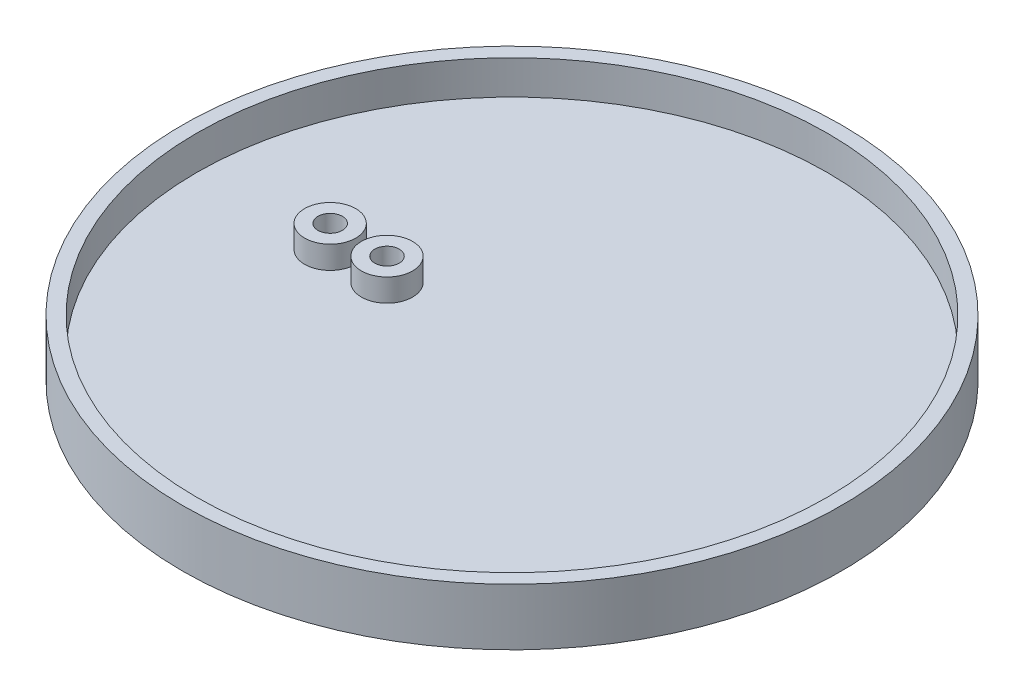
ISO-10303-21;
HEADER;
FILE_DESCRIPTION(('STEP AP214'),'2;1');
FILE_NAME('part.step','',(''),(''),'','','');
FILE_SCHEMA(('AUTOMOTIVE_DESIGN { 1 0 10303 214 1 1 1 1 }'));
ENDSEC;
DATA;
#1=APPLICATION_CONTEXT('core data for automotive mechanical design processes');
#2=APPLICATION_PROTOCOL_DEFINITION('international standard','automotive_design',2000,#1);
#3=PRODUCT_CONTEXT('',#1,'mechanical');
#4=PRODUCT('Part','Part','',(#3));
#5=PRODUCT_RELATED_PRODUCT_CATEGORY('part','',(#4));
#6=PRODUCT_DEFINITION_FORMATION('','',#4);
#7=PRODUCT_DEFINITION_CONTEXT('part definition',#1,'design');
#8=PRODUCT_DEFINITION('design','',#6,#7);
#9=PRODUCT_DEFINITION_SHAPE('','',#8);
#10=(LENGTH_UNIT() NAMED_UNIT(*) SI_UNIT(.MILLI.,.METRE.));
#11=(NAMED_UNIT(*) PLANE_ANGLE_UNIT() SI_UNIT($,.RADIAN.));
#12=(NAMED_UNIT(*) SI_UNIT($,.STERADIAN.) SOLID_ANGLE_UNIT());
#13=UNCERTAINTY_MEASURE_WITH_UNIT(LENGTH_MEASURE(1.E-05),#10,'distance_accuracy_value','');
#14=(GEOMETRIC_REPRESENTATION_CONTEXT(3) GLOBAL_UNCERTAINTY_ASSIGNED_CONTEXT((#13)) GLOBAL_UNIT_ASSIGNED_CONTEXT((#10,
#11,#12)) REPRESENTATION_CONTEXT('',''));
#15=CARTESIAN_POINT('',(0.,0.,0.));
#16=DIRECTION('',(0.,0.,1.));
#17=DIRECTION('',(1.,0.,0.));
#18=AXIS2_PLACEMENT_3D('',#15,#16,#17);
#19=CARTESIAN_POINT('',(0.,4.,0.));
#20=DIRECTION('',(0.,-1.,0.));
#21=DIRECTION('',(0.,0.,-1.));
#22=AXIS2_PLACEMENT_3D('',#19,#20,#21);
#23=CYLINDRICAL_SURFACE('',#22,58.);
#24=CARTESIAN_POINT('',(0.,0.,0.));
#25=DIRECTION('',(0.,1.,0.));
#26=DIRECTION('',(0.,0.,1.));
#27=AXIS2_PLACEMENT_3D('',#24,#25,#26);
#28=CIRCLE('',#27,58.);
#29=CARTESIAN_POINT('',(0.,0.,58.));
#30=VERTEX_POINT('',#29);
#31=EDGE_CURVE('E62',#30,#30,#28,.T.);
#32=ORIENTED_EDGE('',*,*,#31,.T.);
#33=EDGE_LOOP('',(#32));
#34=FACE_BOUND('',#33,.T.);
#35=CARTESIAN_POINT('',(0.,10.,0.));
#36=DIRECTION('',(0.,1.,0.));
#37=DIRECTION('',(0.,0.,1.));
#38=AXIS2_PLACEMENT_3D('',#35,#36,#37);
#39=CIRCLE('',#38,58.);
#40=CARTESIAN_POINT('',(0.,10.,58.));
#41=VERTEX_POINT('',#40);
#42=EDGE_CURVE('E54',#41,#41,#39,.T.);
#43=ORIENTED_EDGE('',*,*,#42,.F.);
#44=EDGE_LOOP('',(#43));
#45=FACE_BOUND('',#44,.T.);
#46=ADVANCED_FACE('F39',(#34,#45),#23,.T.);
#47=CARTESIAN_POINT('',(-22.,0.,0.));
#48=DIRECTION('',(0.,1.,0.));
#49=DIRECTION('',(0.,0.,1.));
#50=AXIS2_PLACEMENT_3D('',#47,#48,#49);
#51=PLANE('',#50);
#52=CARTESIAN_POINT('',(-22.,0.,0.));
#53=DIRECTION('',(0.,1.,0.));
#54=DIRECTION('',(0.,0.,1.));
#55=AXIS2_PLACEMENT_3D('',#52,#53,#54);
#56=CIRCLE('',#55,2.15);
#57=CARTESIAN_POINT('',(-22.,0.,2.15));
#58=VERTEX_POINT('',#57);
#59=EDGE_CURVE('E118',#58,#58,#56,.T.);
#60=ORIENTED_EDGE('',*,*,#59,.T.);
#61=EDGE_LOOP('',(#60));
#62=FACE_BOUND('',#61,.T.);
#63=CARTESIAN_POINT('',(-32.,0.,0.));
#64=DIRECTION('',(0.,1.,0.));
#65=DIRECTION('',(0.,0.,1.));
#66=AXIS2_PLACEMENT_3D('',#63,#64,#65);
#67=CIRCLE('',#66,2.15);
#68=CARTESIAN_POINT('',(-32.,0.,2.15));
#69=VERTEX_POINT('',#68);
#70=EDGE_CURVE('E124',#69,#69,#67,.T.);
#71=ORIENTED_EDGE('',*,*,#70,.T.);
#72=EDGE_LOOP('',(#71));
#73=FACE_BOUND('',#72,.T.);
#74=ORIENTED_EDGE('',*,*,#31,.F.);
#75=EDGE_LOOP('',(#74));
#76=FACE_BOUND('',#75,.T.);
#77=ADVANCED_FACE('F102',(#62,#73,#76),#51,.F.);
#78=CARTESIAN_POINT('',(0.,10.,0.));
#79=DIRECTION('',(0.,1.,0.));
#80=DIRECTION('',(0.,0.,1.));
#81=AXIS2_PLACEMENT_3D('',#78,#79,#80);
#82=PLANE('',#81);
#83=ORIENTED_EDGE('',*,*,#42,.T.);
#84=EDGE_LOOP('',(#83));
#85=FACE_BOUND('',#84,.T.);
#86=CARTESIAN_POINT('',(0.,10.,0.));
#87=DIRECTION('',(0.,1.,0.));
#88=DIRECTION('',(0.,0.,1.));
#89=AXIS2_PLACEMENT_3D('',#86,#87,#88);
#90=CIRCLE('',#89,55.5);
#91=CARTESIAN_POINT('',(0.,10.,55.5));
#92=VERTEX_POINT('',#91);
#93=EDGE_CURVE('E112',#92,#92,#90,.T.);
#94=ORIENTED_EDGE('',*,*,#93,.F.);
#95=EDGE_LOOP('',(#94));
#96=FACE_BOUND('',#95,.T.);
#97=ADVANCED_FACE('F97',(#85,#96),#82,.T.);
#98=CARTESIAN_POINT('',(0.,10.,0.));
#99=DIRECTION('',(0.,-1.,0.));
#100=DIRECTION('',(0.,0.,-1.));
#101=AXIS2_PLACEMENT_3D('',#98,#99,#100);
#102=CYLINDRICAL_SURFACE('',#101,55.5);
#103=CARTESIAN_POINT('',(0.,4.,0.));
#104=DIRECTION('',(0.,1.,0.));
#105=DIRECTION('',(0.,0.,1.));
#106=AXIS2_PLACEMENT_3D('',#103,#104,#105);
#107=CIRCLE('',#106,55.5);
#108=CARTESIAN_POINT('',(0.,4.,55.5));
#109=VERTEX_POINT('',#108);
#110=EDGE_CURVE('E10',#109,#109,#107,.F.);
#111=ORIENTED_EDGE('',*,*,#110,.T.);
#112=EDGE_LOOP('',(#111));
#113=FACE_BOUND('',#112,.T.);
#114=ORIENTED_EDGE('',*,*,#93,.T.);
#115=EDGE_LOOP('',(#114));
#116=FACE_BOUND('',#115,.T.);
#117=ADVANCED_FACE('F88',(#113,#116),#102,.F.);
#118=CARTESIAN_POINT('',(-32.,8.,0.));
#119=DIRECTION('',(0.,1.,0.));
#120=DIRECTION('',(0.,0.,1.));
#121=AXIS2_PLACEMENT_3D('',#118,#119,#120);
#122=PLANE('',#121);
#123=CARTESIAN_POINT('',(-32.,8.,0.));
#124=DIRECTION('',(0.,1.,0.));
#125=DIRECTION('',(0.,0.,1.));
#126=AXIS2_PLACEMENT_3D('',#123,#124,#125);
#127=CIRCLE('',#126,2.15);
#128=CARTESIAN_POINT('',(-32.,8.,2.15));
#129=VERTEX_POINT('',#128);
#130=EDGE_CURVE('E121',#129,#129,#127,.T.);
#131=ORIENTED_EDGE('',*,*,#130,.F.);
#132=EDGE_LOOP('',(#131));
#133=FACE_BOUND('',#132,.T.);
#134=CARTESIAN_POINT('',(-32.,8.,0.));
#135=DIRECTION('',(0.,1.,0.));
#136=DIRECTION('',(0.,0.,1.));
#137=AXIS2_PLACEMENT_3D('',#134,#135,#136);
#138=CIRCLE('',#137,4.5);
#139=CARTESIAN_POINT('',(-32.,8.,4.5));
#140=VERTEX_POINT('',#139);
#141=EDGE_CURVE('E56',#140,#140,#138,.T.);
#142=ORIENTED_EDGE('',*,*,#141,.T.);
#143=EDGE_LOOP('',(#142));
#144=FACE_BOUND('',#143,.T.);
#145=ADVANCED_FACE('F86',(#133,#144),#122,.T.);
#146=CARTESIAN_POINT('',(-22.,8.,0.));
#147=DIRECTION('',(0.,1.,0.));
#148=DIRECTION('',(0.,0.,1.));
#149=AXIS2_PLACEMENT_3D('',#146,#147,#148);
#150=PLANE('',#149);
#151=CARTESIAN_POINT('',(-22.,8.,0.));
#152=DIRECTION('',(0.,1.,0.));
#153=DIRECTION('',(0.,0.,1.));
#154=AXIS2_PLACEMENT_3D('',#151,#152,#153);
#155=CIRCLE('',#154,2.15);
#156=CARTESIAN_POINT('',(-22.,8.,2.15));
#157=VERTEX_POINT('',#156);
#158=EDGE_CURVE('E114',#157,#157,#155,.T.);
#159=ORIENTED_EDGE('',*,*,#158,.F.);
#160=EDGE_LOOP('',(#159));
#161=FACE_BOUND('',#160,.T.);
#162=CARTESIAN_POINT('',(-22.,8.,0.));
#163=DIRECTION('',(0.,1.,0.));
#164=DIRECTION('',(0.,0.,1.));
#165=AXIS2_PLACEMENT_3D('',#162,#163,#164);
#166=CIRCLE('',#165,4.5);
#167=CARTESIAN_POINT('',(-22.,8.,4.5));
#168=VERTEX_POINT('',#167);
#169=EDGE_CURVE('E47',#168,#168,#166,.T.);
#170=ORIENTED_EDGE('',*,*,#169,.T.);
#171=EDGE_LOOP('',(#170));
#172=FACE_BOUND('',#171,.T.);
#173=ADVANCED_FACE('F82',(#161,#172),#150,.T.);
#174=CARTESIAN_POINT('',(-32.,8.,0.));
#175=DIRECTION('',(0.,-1.,0.));
#176=DIRECTION('',(0.,0.,-1.));
#177=AXIS2_PLACEMENT_3D('',#174,#175,#176);
#178=CYLINDRICAL_SURFACE('',#177,4.5);
#179=CARTESIAN_POINT('',(-32.,4.,0.));
#180=DIRECTION('',(0.,1.,0.));
#181=DIRECTION('',(0.,0.,1.));
#182=AXIS2_PLACEMENT_3D('',#179,#180,#181);
#183=CIRCLE('',#182,4.5);
#184=CARTESIAN_POINT('',(-32.,4.,4.5));
#185=VERTEX_POINT('',#184);
#186=EDGE_CURVE('E59',#185,#185,#183,.F.);
#187=ORIENTED_EDGE('',*,*,#186,.F.);
#188=EDGE_LOOP('',(#187));
#189=FACE_BOUND('',#188,.T.);
#190=ORIENTED_EDGE('',*,*,#141,.F.);
#191=EDGE_LOOP('',(#190));
#192=FACE_BOUND('',#191,.T.);
#193=ADVANCED_FACE('F79',(#189,#192),#178,.T.);
#194=CARTESIAN_POINT('',(-22.,8.,0.));
#195=DIRECTION('',(0.,-1.,0.));
#196=DIRECTION('',(0.,0.,-1.));
#197=AXIS2_PLACEMENT_3D('',#194,#195,#196);
#198=CYLINDRICAL_SURFACE('',#197,4.5);
#199=CARTESIAN_POINT('',(-22.,4.,0.));
#200=DIRECTION('',(0.,1.,0.));
#201=DIRECTION('',(0.,0.,1.));
#202=AXIS2_PLACEMENT_3D('',#199,#200,#201);
#203=CIRCLE('',#202,4.5);
#204=CARTESIAN_POINT('',(-22.,4.,4.5));
#205=VERTEX_POINT('',#204);
#206=EDGE_CURVE('E43',#205,#205,#203,.T.);
#207=ORIENTED_EDGE('',*,*,#206,.T.);
#208=EDGE_LOOP('',(#207));
#209=FACE_BOUND('',#208,.T.);
#210=ORIENTED_EDGE('',*,*,#169,.F.);
#211=EDGE_LOOP('',(#210));
#212=FACE_BOUND('',#211,.T.);
#213=ADVANCED_FACE('F41',(#209,#212),#198,.T.);
#214=CARTESIAN_POINT('',(0.,4.,0.));
#215=DIRECTION('',(0.,1.,0.));
#216=DIRECTION('',(0.,0.,1.));
#217=AXIS2_PLACEMENT_3D('',#214,#215,#216);
#218=PLANE('',#217);
#219=ORIENTED_EDGE('',*,*,#206,.F.);
#220=EDGE_LOOP('',(#219));
#221=FACE_BOUND('',#220,.T.);
#222=ORIENTED_EDGE('',*,*,#186,.T.);
#223=EDGE_LOOP('',(#222));
#224=FACE_BOUND('',#223,.T.);
#225=ORIENTED_EDGE('',*,*,#110,.F.);
#226=EDGE_LOOP('',(#225));
#227=FACE_BOUND('',#226,.T.);
#228=ADVANCED_FACE('F71',(#221,#224,#227),#218,.T.);
#229=CARTESIAN_POINT('',(-22.,8.,0.));
#230=DIRECTION('',(0.,-1.,0.));
#231=DIRECTION('',(0.,0.,-1.));
#232=AXIS2_PLACEMENT_3D('',#229,#230,#231);
#233=CYLINDRICAL_SURFACE('',#232,2.15);
#234=ORIENTED_EDGE('',*,*,#158,.T.);
#235=EDGE_LOOP('',(#234));
#236=FACE_BOUND('',#235,.T.);
#237=ORIENTED_EDGE('',*,*,#59,.F.);
#238=EDGE_LOOP('',(#237));
#239=FACE_BOUND('',#238,.T.);
#240=ADVANCED_FACE('F74',(#236,#239),#233,.F.);
#241=CARTESIAN_POINT('',(-32.,8.,0.));
#242=DIRECTION('',(0.,-1.,0.));
#243=DIRECTION('',(0.,0.,-1.));
#244=AXIS2_PLACEMENT_3D('',#241,#242,#243);
#245=CYLINDRICAL_SURFACE('',#244,2.15);
#246=ORIENTED_EDGE('',*,*,#130,.T.);
#247=EDGE_LOOP('',(#246));
#248=FACE_BOUND('',#247,.T.);
#249=ORIENTED_EDGE('',*,*,#70,.F.);
#250=EDGE_LOOP('',(#249));
#251=FACE_BOUND('',#250,.T.);
#252=ADVANCED_FACE('F132',(#248,#251),#245,.F.);
#253=CLOSED_SHELL('',(#46,#77,#97,#117,#145,#173,#193,#213,#228,#240,#252));
#254=MANIFOLD_SOLID_BREP('B2',#253);
#255=ADVANCED_BREP_SHAPE_REPRESENTATION('',(#18,#254),#14);
#256=SHAPE_DEFINITION_REPRESENTATION(#9,#255);
ENDSEC;
END-ISO-10303-21;
